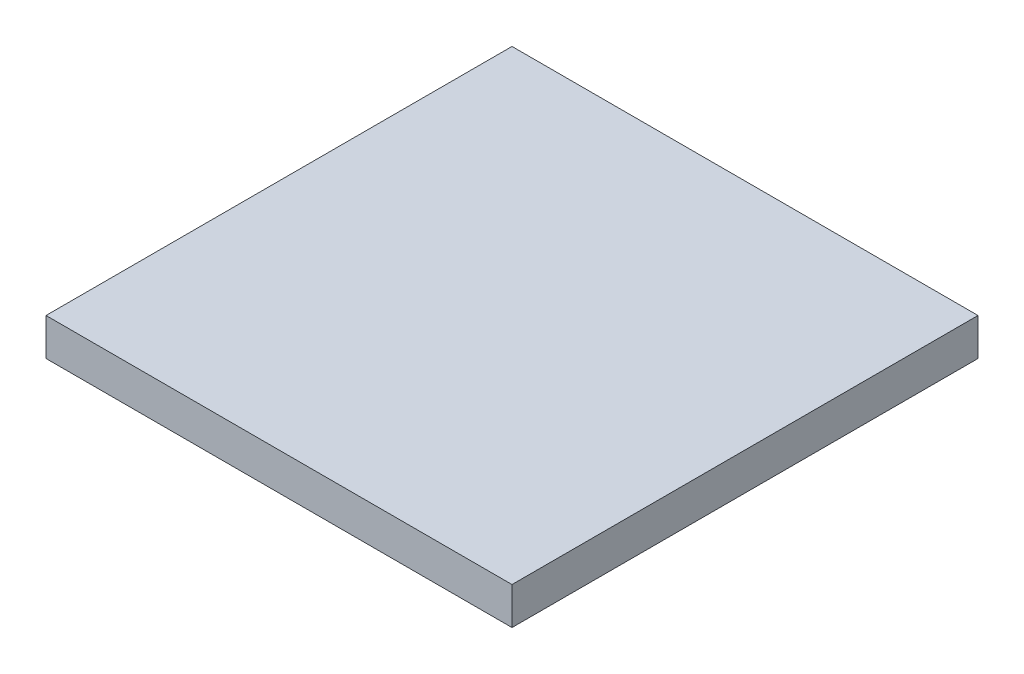
ISO-10303-21;
HEADER;
FILE_DESCRIPTION(('STEP AP214'),'2;1');
FILE_NAME('part.step','',(''),(''),'','','');
FILE_SCHEMA(('AUTOMOTIVE_DESIGN { 1 0 10303 214 1 1 1 1 }'));
ENDSEC;
DATA;
#1=APPLICATION_CONTEXT('core data for automotive mechanical design processes');
#2=APPLICATION_PROTOCOL_DEFINITION('international standard','automotive_design',2000,#1);
#3=PRODUCT_CONTEXT('',#1,'mechanical');
#4=PRODUCT('Part','Part','',(#3));
#5=PRODUCT_RELATED_PRODUCT_CATEGORY('part','',(#4));
#6=PRODUCT_DEFINITION_FORMATION('','',#4);
#7=PRODUCT_DEFINITION_CONTEXT('part definition',#1,'design');
#8=PRODUCT_DEFINITION('design','',#6,#7);
#9=PRODUCT_DEFINITION_SHAPE('','',#8);
#10=(LENGTH_UNIT() NAMED_UNIT(*) SI_UNIT(.MILLI.,.METRE.));
#11=(NAMED_UNIT(*) PLANE_ANGLE_UNIT() SI_UNIT($,.RADIAN.));
#12=(NAMED_UNIT(*) SI_UNIT($,.STERADIAN.) SOLID_ANGLE_UNIT());
#13=UNCERTAINTY_MEASURE_WITH_UNIT(LENGTH_MEASURE(1.E-05),#10,'distance_accuracy_value','');
#14=(GEOMETRIC_REPRESENTATION_CONTEXT(3) GLOBAL_UNCERTAINTY_ASSIGNED_CONTEXT((#13)) GLOBAL_UNIT_ASSIGNED_CONTEXT((#10,
#11,#12)) REPRESENTATION_CONTEXT('',''));
#15=CARTESIAN_POINT('',(0.,0.,0.));
#16=DIRECTION('',(0.,0.,1.));
#17=DIRECTION('',(1.,0.,0.));
#18=AXIS2_PLACEMENT_3D('',#15,#16,#17);
#19=CARTESIAN_POINT('',(0.,3.,0.));
#20=DIRECTION('',(1.,0.,0.));
#21=DIRECTION('',(0.,0.,-1.));
#22=AXIS2_PLACEMENT_3D('',#19,#20,#21);
#23=PLANE('',#22);
#24=DIRECTION('',(0.,0.,1.));
#25=VECTOR('',#24,1.);
#26=CARTESIAN_POINT('',(0.,0.,0.));
#27=LINE('',#26,#25);
#28=CARTESIAN_POINT('',(0.,0.,-37.5));
#29=VERTEX_POINT('',#28);
#30=CARTESIAN_POINT('',(0.,0.,0.));
#31=VERTEX_POINT('',#30);
#32=EDGE_CURVE('E107',#29,#31,#27,.T.);
#33=ORIENTED_EDGE('',*,*,#32,.T.);
#34=DIRECTION('',(0.,-1.,0.));
#35=VECTOR('',#34,1.);
#36=CARTESIAN_POINT('',(0.,3.,0.));
#37=LINE('',#36,#35);
#38=CARTESIAN_POINT('',(0.,3.,0.));
#39=VERTEX_POINT('',#38);
#40=EDGE_CURVE('E11',#39,#31,#37,.T.);
#41=ORIENTED_EDGE('',*,*,#40,.F.);
#42=DIRECTION('',(0.,0.,1.));
#43=VECTOR('',#42,1.);
#44=CARTESIAN_POINT('',(0.,3.,0.));
#45=LINE('',#44,#43);
#46=CARTESIAN_POINT('',(0.,3.,-37.5));
#47=VERTEX_POINT('',#46);
#48=EDGE_CURVE('E91',#47,#39,#45,.T.);
#49=ORIENTED_EDGE('',*,*,#48,.F.);
#50=DIRECTION('',(0.,-1.,0.));
#51=VECTOR('',#50,1.);
#52=CARTESIAN_POINT('',(0.,3.,-37.5));
#53=LINE('',#52,#51);
#54=EDGE_CURVE('E103',#47,#29,#53,.T.);
#55=ORIENTED_EDGE('',*,*,#54,.T.);
#56=EDGE_LOOP('',(#33,#41,#49,#55));
#57=FACE_BOUND('',#56,.T.);
#58=ADVANCED_FACE('F39',(#57),#23,.F.);
#59=CARTESIAN_POINT('',(0.,3.,0.));
#60=DIRECTION('',(0.,0.,-1.));
#61=DIRECTION('',(-1.,0.,0.));
#62=AXIS2_PLACEMENT_3D('',#59,#60,#61);
#63=PLANE('',#62);
#64=DIRECTION('',(1.,0.,0.));
#65=VECTOR('',#64,1.);
#66=CARTESIAN_POINT('',(0.,0.,0.));
#67=LINE('',#66,#65);
#68=CARTESIAN_POINT('',(37.5,0.,0.));
#69=VERTEX_POINT('',#68);
#70=EDGE_CURVE('E96',#31,#69,#67,.T.);
#71=ORIENTED_EDGE('',*,*,#70,.T.);
#72=DIRECTION('',(0.,-1.,0.));
#73=VECTOR('',#72,1.);
#74=CARTESIAN_POINT('',(37.5,3.,0.));
#75=LINE('',#74,#73);
#76=CARTESIAN_POINT('',(37.5,3.,0.));
#77=VERTEX_POINT('',#76);
#78=EDGE_CURVE('E48',#77,#69,#75,.T.);
#79=ORIENTED_EDGE('',*,*,#78,.F.);
#80=DIRECTION('',(1.,0.,0.));
#81=VECTOR('',#80,1.);
#82=CARTESIAN_POINT('',(0.,3.,0.));
#83=LINE('',#82,#81);
#84=EDGE_CURVE('E86',#39,#77,#83,.T.);
#85=ORIENTED_EDGE('',*,*,#84,.F.);
#86=ORIENTED_EDGE('',*,*,#40,.T.);
#87=EDGE_LOOP('',(#71,#79,#85,#86));
#88=FACE_BOUND('',#87,.T.);
#89=ADVANCED_FACE('F95',(#88),#63,.F.);
#90=CARTESIAN_POINT('',(37.5,3.,0.));
#91=DIRECTION('',(-1.,0.,0.));
#92=DIRECTION('',(0.,0.,1.));
#93=AXIS2_PLACEMENT_3D('',#90,#91,#92);
#94=PLANE('',#93);
#95=DIRECTION('',(0.,0.,-1.));
#96=VECTOR('',#95,1.);
#97=CARTESIAN_POINT('',(37.5,0.,0.));
#98=LINE('',#97,#96);
#99=CARTESIAN_POINT('',(37.5,0.,-37.5));
#100=VERTEX_POINT('',#99);
#101=EDGE_CURVE('E73',#69,#100,#98,.T.);
#102=ORIENTED_EDGE('',*,*,#101,.T.);
#103=DIRECTION('',(0.,-1.,0.));
#104=VECTOR('',#103,1.);
#105=CARTESIAN_POINT('',(37.5,3.,-37.5));
#106=LINE('',#105,#104);
#107=CARTESIAN_POINT('',(37.5,3.,-37.5));
#108=VERTEX_POINT('',#107);
#109=EDGE_CURVE('E98',#108,#100,#106,.T.);
#110=ORIENTED_EDGE('',*,*,#109,.F.);
#111=DIRECTION('',(0.,0.,-1.));
#112=VECTOR('',#111,1.);
#113=CARTESIAN_POINT('',(37.5,3.,0.));
#114=LINE('',#113,#112);
#115=EDGE_CURVE('E89',#77,#108,#114,.T.);
#116=ORIENTED_EDGE('',*,*,#115,.F.);
#117=ORIENTED_EDGE('',*,*,#78,.T.);
#118=EDGE_LOOP('',(#102,#110,#116,#117));
#119=FACE_BOUND('',#118,.T.);
#120=ADVANCED_FACE('F99',(#119),#94,.F.);
#121=CARTESIAN_POINT('',(0.,3.,-37.5));
#122=DIRECTION('',(0.,0.,1.));
#123=DIRECTION('',(1.,0.,0.));
#124=AXIS2_PLACEMENT_3D('',#121,#122,#123);
#125=PLANE('',#124);
#126=DIRECTION('',(-1.,0.,0.));
#127=VECTOR('',#126,1.);
#128=CARTESIAN_POINT('',(0.,0.,-37.5));
#129=LINE('',#128,#127);
#130=EDGE_CURVE('E79',#100,#29,#129,.T.);
#131=ORIENTED_EDGE('',*,*,#130,.T.);
#132=ORIENTED_EDGE('',*,*,#54,.F.);
#133=DIRECTION('',(-1.,0.,0.));
#134=VECTOR('',#133,1.);
#135=CARTESIAN_POINT('',(0.,3.,-37.5));
#136=LINE('',#135,#134);
#137=EDGE_CURVE('E56',#108,#47,#136,.T.);
#138=ORIENTED_EDGE('',*,*,#137,.F.);
#139=ORIENTED_EDGE('',*,*,#109,.T.);
#140=EDGE_LOOP('',(#131,#132,#138,#139));
#141=FACE_BOUND('',#140,.T.);
#142=ADVANCED_FACE('F120',(#141),#125,.F.);
#143=CARTESIAN_POINT('',(0.,3.,0.));
#144=DIRECTION('',(0.,-1.,0.));
#145=DIRECTION('',(0.,0.,-1.));
#146=AXIS2_PLACEMENT_3D('',#143,#144,#145);
#147=PLANE('',#146);
#148=ORIENTED_EDGE('',*,*,#48,.T.);
#149=ORIENTED_EDGE('',*,*,#84,.T.);
#150=ORIENTED_EDGE('',*,*,#115,.T.);
#151=ORIENTED_EDGE('',*,*,#137,.T.);
#152=EDGE_LOOP('',(#148,#149,#150,#151));
#153=FACE_BOUND('',#152,.T.);
#154=ADVANCED_FACE('F87',(#153),#147,.F.);
#155=CARTESIAN_POINT('',(0.,0.,0.));
#156=DIRECTION('',(0.,-1.,0.));
#157=DIRECTION('',(0.,0.,-1.));
#158=AXIS2_PLACEMENT_3D('',#155,#156,#157);
#159=PLANE('',#158);
#160=ORIENTED_EDGE('',*,*,#32,.F.);
#161=ORIENTED_EDGE('',*,*,#130,.F.);
#162=ORIENTED_EDGE('',*,*,#101,.F.);
#163=ORIENTED_EDGE('',*,*,#70,.F.);
#164=EDGE_LOOP('',(#160,#161,#162,#163));
#165=FACE_BOUND('',#164,.T.);
#166=ADVANCED_FACE('F123',(#165),#159,.T.);
#167=CLOSED_SHELL('',(#58,#89,#120,#142,#154,#166));
#168=MANIFOLD_SOLID_BREP('B2',#167);
#169=ADVANCED_BREP_SHAPE_REPRESENTATION('',(#18,#168),#14);
#170=SHAPE_DEFINITION_REPRESENTATION(#9,#169);
ENDSEC;
END-ISO-10303-21;
